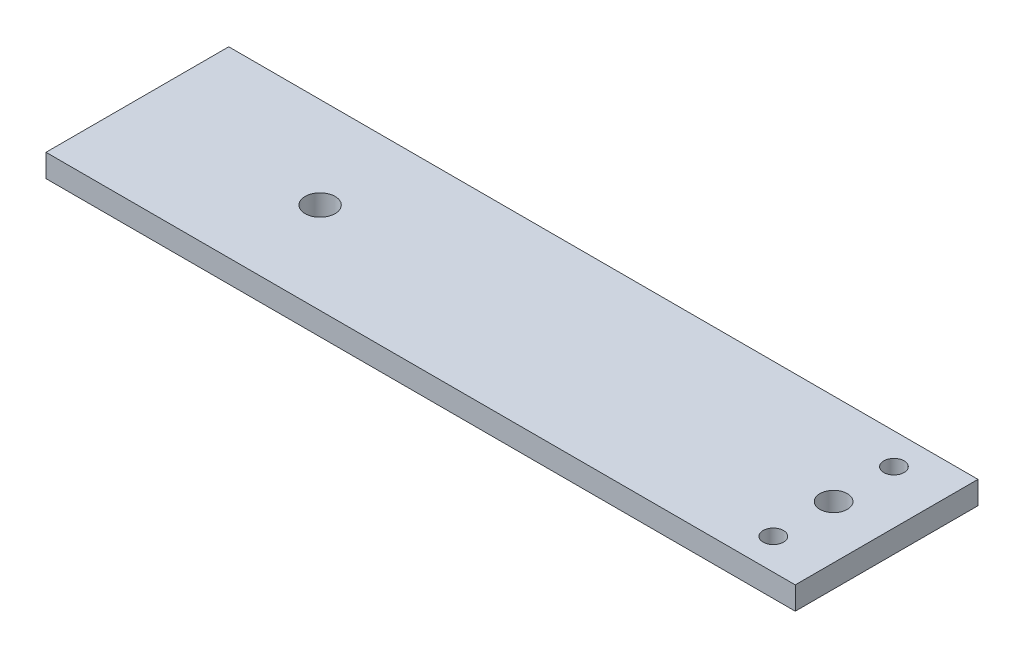
ISO-10303-21;
HEADER;
FILE_DESCRIPTION(('STEP AP214'),'2;1');
FILE_NAME('part.step','',(''),(''),'','','');
FILE_SCHEMA(('AUTOMOTIVE_DESIGN { 1 0 10303 214 1 1 1 1 }'));
ENDSEC;
DATA;
#1=APPLICATION_CONTEXT('core data for automotive mechanical design processes');
#2=APPLICATION_PROTOCOL_DEFINITION('international standard','automotive_design',2000,#1);
#3=PRODUCT_CONTEXT('',#1,'mechanical');
#4=PRODUCT('Part','Part','',(#3));
#5=PRODUCT_RELATED_PRODUCT_CATEGORY('part','',(#4));
#6=PRODUCT_DEFINITION_FORMATION('','',#4);
#7=PRODUCT_DEFINITION_CONTEXT('part definition',#1,'design');
#8=PRODUCT_DEFINITION('design','',#6,#7);
#9=PRODUCT_DEFINITION_SHAPE('','',#8);
#10=(LENGTH_UNIT() NAMED_UNIT(*) SI_UNIT(.MILLI.,.METRE.));
#11=(NAMED_UNIT(*) PLANE_ANGLE_UNIT() SI_UNIT($,.RADIAN.));
#12=(NAMED_UNIT(*) SI_UNIT($,.STERADIAN.) SOLID_ANGLE_UNIT());
#13=UNCERTAINTY_MEASURE_WITH_UNIT(LENGTH_MEASURE(1.E-05),#10,'distance_accuracy_value','');
#14=(GEOMETRIC_REPRESENTATION_CONTEXT(3) GLOBAL_UNCERTAINTY_ASSIGNED_CONTEXT((#13)) GLOBAL_UNIT_ASSIGNED_CONTEXT((#10,
#11,#12)) REPRESENTATION_CONTEXT('',''));
#15=CARTESIAN_POINT('',(0.,0.,0.));
#16=DIRECTION('',(0.,0.,1.));
#17=DIRECTION('',(1.,0.,0.));
#18=AXIS2_PLACEMENT_3D('',#15,#16,#17);
#19=CARTESIAN_POINT('',(0.,3.175,-25.4));
#20=DIRECTION('',(0.,0.,-1.));
#21=DIRECTION('',(-1.,0.,0.));
#22=AXIS2_PLACEMENT_3D('',#19,#20,#21);
#23=PLANE('',#22);
#24=DIRECTION('',(1.,0.,0.));
#25=VECTOR('',#24,1.);
#26=CARTESIAN_POINT('',(0.,0.,-25.4));
#27=LINE('',#26,#25);
#28=CARTESIAN_POINT('',(0.,0.,-25.4));
#29=VERTEX_POINT('',#28);
#30=CARTESIAN_POINT('',(104.14,0.,-25.4));
#31=VERTEX_POINT('',#30);
#32=EDGE_CURVE('E129',#29,#31,#27,.T.);
#33=ORIENTED_EDGE('',*,*,#32,.F.);
#34=DIRECTION('',(0.,-1.,0.));
#35=VECTOR('',#34,1.);
#36=CARTESIAN_POINT('',(0.,3.175,-25.4));
#37=LINE('',#36,#35);
#38=CARTESIAN_POINT('',(0.,3.175,-25.4));
#39=VERTEX_POINT('',#38);
#40=EDGE_CURVE('E11',#39,#29,#37,.T.);
#41=ORIENTED_EDGE('',*,*,#40,.F.);
#42=DIRECTION('',(1.,0.,0.));
#43=VECTOR('',#42,1.);
#44=CARTESIAN_POINT('',(0.,3.175,-25.4));
#45=LINE('',#44,#43);
#46=CARTESIAN_POINT('',(104.14,3.175,-25.4));
#47=VERTEX_POINT('',#46);
#48=EDGE_CURVE('E107',#39,#47,#45,.T.);
#49=ORIENTED_EDGE('',*,*,#48,.T.);
#50=DIRECTION('',(0.,-1.,0.));
#51=VECTOR('',#50,1.);
#52=CARTESIAN_POINT('',(104.14,3.175,-25.4));
#53=LINE('',#52,#51);
#54=EDGE_CURVE('E83',#47,#31,#53,.T.);
#55=ORIENTED_EDGE('',*,*,#54,.T.);
#56=EDGE_LOOP('',(#33,#41,#49,#55));
#57=FACE_BOUND('',#56,.T.);
#58=ADVANCED_FACE('F41',(#57),#23,.T.);
#59=CARTESIAN_POINT('',(0.,3.175,0.));
#60=DIRECTION('',(-1.,0.,0.));
#61=DIRECTION('',(0.,0.,1.));
#62=AXIS2_PLACEMENT_3D('',#59,#60,#61);
#63=PLANE('',#62);
#64=DIRECTION('',(0.,0.,-1.));
#65=VECTOR('',#64,1.);
#66=CARTESIAN_POINT('',(0.,0.,0.));
#67=LINE('',#66,#65);
#68=CARTESIAN_POINT('',(0.,0.,0.));
#69=VERTEX_POINT('',#68);
#70=EDGE_CURVE('E95',#69,#29,#67,.T.);
#71=ORIENTED_EDGE('',*,*,#70,.F.);
#72=DIRECTION('',(0.,-1.,0.));
#73=VECTOR('',#72,1.);
#74=CARTESIAN_POINT('',(0.,3.175,0.));
#75=LINE('',#74,#73);
#76=CARTESIAN_POINT('',(0.,3.175,0.));
#77=VERTEX_POINT('',#76);
#78=EDGE_CURVE('E52',#77,#69,#75,.T.);
#79=ORIENTED_EDGE('',*,*,#78,.F.);
#80=DIRECTION('',(0.,0.,-1.));
#81=VECTOR('',#80,1.);
#82=CARTESIAN_POINT('',(0.,3.175,0.));
#83=LINE('',#82,#81);
#84=EDGE_CURVE('E93',#77,#39,#83,.T.);
#85=ORIENTED_EDGE('',*,*,#84,.T.);
#86=ORIENTED_EDGE('',*,*,#40,.T.);
#87=EDGE_LOOP('',(#71,#79,#85,#86));
#88=FACE_BOUND('',#87,.T.);
#89=ADVANCED_FACE('F91',(#88),#63,.T.);
#90=CARTESIAN_POINT('',(0.,3.175,0.));
#91=DIRECTION('',(0.,0.,-1.));
#92=DIRECTION('',(-1.,0.,0.));
#93=AXIS2_PLACEMENT_3D('',#90,#91,#92);
#94=PLANE('',#93);
#95=DIRECTION('',(1.,0.,0.));
#96=VECTOR('',#95,1.);
#97=CARTESIAN_POINT('',(0.,0.,0.));
#98=LINE('',#97,#96);
#99=CARTESIAN_POINT('',(104.14,0.,0.));
#100=VERTEX_POINT('',#99);
#101=EDGE_CURVE('E134',#69,#100,#98,.T.);
#102=ORIENTED_EDGE('',*,*,#101,.T.);
#103=DIRECTION('',(0.,-1.,0.));
#104=VECTOR('',#103,1.);
#105=CARTESIAN_POINT('',(104.14,3.175,0.));
#106=LINE('',#105,#104);
#107=CARTESIAN_POINT('',(104.14,3.175,0.));
#108=VERTEX_POINT('',#107);
#109=EDGE_CURVE('E99',#108,#100,#106,.T.);
#110=ORIENTED_EDGE('',*,*,#109,.F.);
#111=DIRECTION('',(1.,0.,0.));
#112=VECTOR('',#111,1.);
#113=CARTESIAN_POINT('',(0.,3.175,0.));
#114=LINE('',#113,#112);
#115=EDGE_CURVE('E102',#77,#108,#114,.T.);
#116=ORIENTED_EDGE('',*,*,#115,.F.);
#117=ORIENTED_EDGE('',*,*,#78,.T.);
#118=EDGE_LOOP('',(#102,#110,#116,#117));
#119=FACE_BOUND('',#118,.T.);
#120=ADVANCED_FACE('F103',(#119),#94,.F.);
#121=CARTESIAN_POINT('',(96.774,3.175,-21.082));
#122=DIRECTION('',(0.,-1.,0.));
#123=DIRECTION('',(0.,0.,-1.));
#124=AXIS2_PLACEMENT_3D('',#121,#122,#123);
#125=CYLINDRICAL_SURFACE('',#124,1.41224000000001);
#126=CARTESIAN_POINT('',(96.774,3.175,-21.082));
#127=DIRECTION('',(0.,1.,0.));
#128=DIRECTION('',(0.,0.,1.));
#129=AXIS2_PLACEMENT_3D('',#126,#127,#128);
#130=CIRCLE('',#129,1.41224000000001);
#131=CARTESIAN_POINT('',(96.774,3.175,-19.66976));
#132=VERTEX_POINT('',#131);
#133=EDGE_CURVE('E111',#132,#132,#130,.T.);
#134=ORIENTED_EDGE('',*,*,#133,.T.);
#135=EDGE_LOOP('',(#134));
#136=FACE_BOUND('',#135,.T.);
#137=CARTESIAN_POINT('',(96.774,0.,-21.082));
#138=DIRECTION('',(0.,1.,0.));
#139=DIRECTION('',(0.,0.,1.));
#140=AXIS2_PLACEMENT_3D('',#137,#138,#139);
#141=CIRCLE('',#140,1.41224000000001);
#142=CARTESIAN_POINT('',(96.774,0.,-19.66976));
#143=VERTEX_POINT('',#142);
#144=EDGE_CURVE('E125',#143,#143,#141,.T.);
#145=ORIENTED_EDGE('',*,*,#144,.F.);
#146=EDGE_LOOP('',(#145));
#147=FACE_BOUND('',#146,.T.);
#148=ADVANCED_FACE('F154',(#136,#147),#125,.F.);
#149=CARTESIAN_POINT('',(96.774,3.175,-12.7));
#150=DIRECTION('',(0.,-1.,0.));
#151=DIRECTION('',(0.,0.,-1.));
#152=AXIS2_PLACEMENT_3D('',#149,#150,#151);
#153=CYLINDRICAL_SURFACE('',#152,1.90500000000001);
#154=CARTESIAN_POINT('',(96.774,3.175,-12.7));
#155=DIRECTION('',(0.,1.,0.));
#156=DIRECTION('',(0.,0.,1.));
#157=AXIS2_PLACEMENT_3D('',#154,#155,#156);
#158=CIRCLE('',#157,1.90500000000001);
#159=CARTESIAN_POINT('',(96.774,3.175,-10.795));
#160=VERTEX_POINT('',#159);
#161=EDGE_CURVE('E167',#160,#160,#158,.T.);
#162=ORIENTED_EDGE('',*,*,#161,.T.);
#163=EDGE_LOOP('',(#162));
#164=FACE_BOUND('',#163,.T.);
#165=CARTESIAN_POINT('',(96.774,0.,-12.7));
#166=DIRECTION('',(0.,1.,0.));
#167=DIRECTION('',(0.,0.,1.));
#168=AXIS2_PLACEMENT_3D('',#165,#166,#167);
#169=CIRCLE('',#168,1.90500000000001);
#170=CARTESIAN_POINT('',(96.774,0.,-10.795));
#171=VERTEX_POINT('',#170);
#172=EDGE_CURVE('E121',#171,#171,#169,.T.);
#173=ORIENTED_EDGE('',*,*,#172,.F.);
#174=EDGE_LOOP('',(#173));
#175=FACE_BOUND('',#174,.T.);
#176=ADVANCED_FACE('F156',(#164,#175),#153,.F.);
#177=CARTESIAN_POINT('',(96.774,3.175,-4.318));
#178=DIRECTION('',(0.,-1.,0.));
#179=DIRECTION('',(0.,0.,-1.));
#180=AXIS2_PLACEMENT_3D('',#177,#178,#179);
#181=CYLINDRICAL_SURFACE('',#180,1.41224000000001);
#182=CARTESIAN_POINT('',(96.774,3.175,-4.318));
#183=DIRECTION('',(0.,1.,0.));
#184=DIRECTION('',(0.,0.,1.));
#185=AXIS2_PLACEMENT_3D('',#182,#183,#184);
#186=CIRCLE('',#185,1.41224000000001);
#187=CARTESIAN_POINT('',(96.774,3.175,-2.90575999999999));
#188=VERTEX_POINT('',#187);
#189=EDGE_CURVE('E139',#188,#188,#186,.T.);
#190=ORIENTED_EDGE('',*,*,#189,.T.);
#191=EDGE_LOOP('',(#190));
#192=FACE_BOUND('',#191,.T.);
#193=CARTESIAN_POINT('',(96.774,0.,-4.318));
#194=DIRECTION('',(0.,1.,0.));
#195=DIRECTION('',(0.,0.,1.));
#196=AXIS2_PLACEMENT_3D('',#193,#194,#195);
#197=CIRCLE('',#196,1.41224000000001);
#198=CARTESIAN_POINT('',(96.774,0.,-2.90575999999999));
#199=VERTEX_POINT('',#198);
#200=EDGE_CURVE('E117',#199,#199,#197,.T.);
#201=ORIENTED_EDGE('',*,*,#200,.F.);
#202=EDGE_LOOP('',(#201));
#203=FACE_BOUND('',#202,.T.);
#204=ADVANCED_FACE('F43',(#192,#203),#181,.F.);
#205=CARTESIAN_POINT('',(104.14,3.175,0.));
#206=DIRECTION('',(-1.,0.,0.));
#207=DIRECTION('',(0.,0.,1.));
#208=AXIS2_PLACEMENT_3D('',#205,#206,#207);
#209=PLANE('',#208);
#210=DIRECTION('',(0.,0.,-1.));
#211=VECTOR('',#210,1.);
#212=CARTESIAN_POINT('',(104.14,0.,0.));
#213=LINE('',#212,#211);
#214=EDGE_CURVE('E76',#100,#31,#213,.T.);
#215=ORIENTED_EDGE('',*,*,#214,.T.);
#216=ORIENTED_EDGE('',*,*,#54,.F.);
#217=DIRECTION('',(0.,0.,-1.));
#218=VECTOR('',#217,1.);
#219=CARTESIAN_POINT('',(104.14,3.175,0.));
#220=LINE('',#219,#218);
#221=EDGE_CURVE('E60',#108,#47,#220,.T.);
#222=ORIENTED_EDGE('',*,*,#221,.F.);
#223=ORIENTED_EDGE('',*,*,#109,.T.);
#224=EDGE_LOOP('',(#215,#216,#222,#223));
#225=FACE_BOUND('',#224,.T.);
#226=ADVANCED_FACE('F144',(#225),#209,.F.);
#227=CARTESIAN_POINT('',(0.,3.175,0.));
#228=DIRECTION('',(0.,1.,0.));
#229=DIRECTION('',(0.,0.,1.));
#230=AXIS2_PLACEMENT_3D('',#227,#228,#229);
#231=PLANE('',#230);
#232=CARTESIAN_POINT('',(25.4,3.175,-12.7));
#233=DIRECTION('',(0.,1.,0.));
#234=DIRECTION('',(0.,0.,1.));
#235=AXIS2_PLACEMENT_3D('',#232,#233,#234);
#236=CIRCLE('',#235,2.0828);
#237=CARTESIAN_POINT('',(25.4,3.175,-10.6172));
#238=VERTEX_POINT('',#237);
#239=EDGE_CURVE('E249',#238,#238,#236,.T.);
#240=ORIENTED_EDGE('',*,*,#239,.F.);
#241=EDGE_LOOP('',(#240));
#242=FACE_BOUND('',#241,.T.);
#243=ORIENTED_EDGE('',*,*,#189,.F.);
#244=EDGE_LOOP('',(#243));
#245=FACE_BOUND('',#244,.T.);
#246=ORIENTED_EDGE('',*,*,#161,.F.);
#247=EDGE_LOOP('',(#246));
#248=FACE_BOUND('',#247,.T.);
#249=ORIENTED_EDGE('',*,*,#133,.F.);
#250=EDGE_LOOP('',(#249));
#251=FACE_BOUND('',#250,.T.);
#252=ORIENTED_EDGE('',*,*,#48,.F.);
#253=ORIENTED_EDGE('',*,*,#84,.F.);
#254=ORIENTED_EDGE('',*,*,#115,.T.);
#255=ORIENTED_EDGE('',*,*,#221,.T.);
#256=EDGE_LOOP('',(#252,#253,#254,#255));
#257=FACE_BOUND('',#256,.T.);
#258=ADVANCED_FACE('F106',(#242,#245,#248,#251,#257),#231,.T.);
#259=CARTESIAN_POINT('',(0.,0.,0.));
#260=DIRECTION('',(0.,1.,0.));
#261=DIRECTION('',(0.,0.,1.));
#262=AXIS2_PLACEMENT_3D('',#259,#260,#261);
#263=PLANE('',#262);
#264=CARTESIAN_POINT('',(25.4,0.,-12.7));
#265=DIRECTION('',(0.,1.,0.));
#266=DIRECTION('',(0.,0.,1.));
#267=AXIS2_PLACEMENT_3D('',#264,#265,#266);
#268=CIRCLE('',#267,2.0828);
#269=CARTESIAN_POINT('',(25.4,0.,-10.6172));
#270=VERTEX_POINT('',#269);
#271=EDGE_CURVE('E45',#270,#270,#268,.T.);
#272=ORIENTED_EDGE('',*,*,#271,.T.);
#273=EDGE_LOOP('',(#272));
#274=FACE_BOUND('',#273,.T.);
#275=ORIENTED_EDGE('',*,*,#200,.T.);
#276=EDGE_LOOP('',(#275));
#277=FACE_BOUND('',#276,.T.);
#278=ORIENTED_EDGE('',*,*,#172,.T.);
#279=EDGE_LOOP('',(#278));
#280=FACE_BOUND('',#279,.T.);
#281=ORIENTED_EDGE('',*,*,#144,.T.);
#282=EDGE_LOOP('',(#281));
#283=FACE_BOUND('',#282,.T.);
#284=ORIENTED_EDGE('',*,*,#32,.T.);
#285=ORIENTED_EDGE('',*,*,#214,.F.);
#286=ORIENTED_EDGE('',*,*,#101,.F.);
#287=ORIENTED_EDGE('',*,*,#70,.T.);
#288=EDGE_LOOP('',(#284,#285,#286,#287));
#289=FACE_BOUND('',#288,.T.);
#290=ADVANCED_FACE('F145',(#274,#277,#280,#283,#289),#263,.F.);
#291=CARTESIAN_POINT('',(25.4,-3.175,-12.7));
#292=DIRECTION('',(0.,1.,0.));
#293=DIRECTION('',(0.,0.,1.));
#294=AXIS2_PLACEMENT_3D('',#291,#292,#293);
#295=CYLINDRICAL_SURFACE('',#294,2.0828);
#296=ORIENTED_EDGE('',*,*,#239,.T.);
#297=EDGE_LOOP('',(#296));
#298=FACE_BOUND('',#297,.T.);
#299=ORIENTED_EDGE('',*,*,#271,.F.);
#300=EDGE_LOOP('',(#299));
#301=FACE_BOUND('',#300,.T.);
#302=ADVANCED_FACE('F172',(#298,#301),#295,.F.);
#303=CLOSED_SHELL('',(#58,#89,#120,#148,#176,#204,#226,#258,#290,#302));
#304=MANIFOLD_SOLID_BREP('B2',#303);
#305=ADVANCED_BREP_SHAPE_REPRESENTATION('',(#18,#304),#14);
#306=SHAPE_DEFINITION_REPRESENTATION(#9,#305);
ENDSEC;
END-ISO-10303-21;
